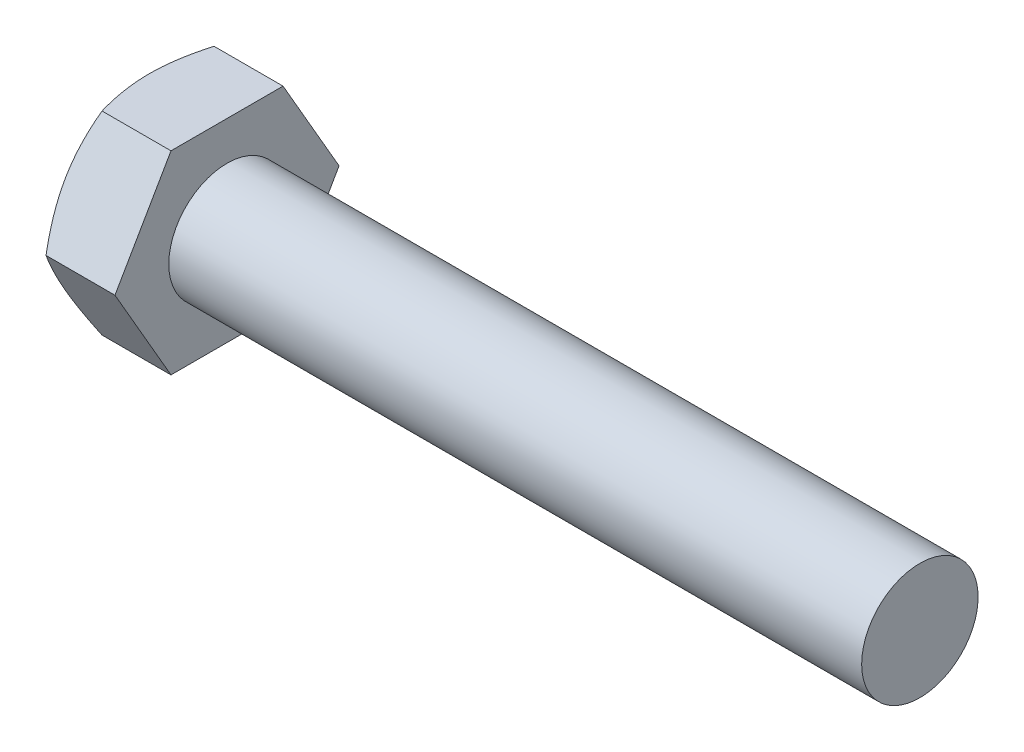
ISO-10303-21;
HEADER;
FILE_DESCRIPTION(('STEP AP214'),'2;1');
FILE_NAME('part.step','',(''),(''),'','','');
FILE_SCHEMA(('AUTOMOTIVE_DESIGN { 1 0 10303 214 1 1 1 1 }'));
ENDSEC;
DATA;
#1=APPLICATION_CONTEXT('core data for automotive mechanical design processes');
#2=APPLICATION_PROTOCOL_DEFINITION('international standard','automotive_design',2000,#1);
#3=PRODUCT_CONTEXT('',#1,'mechanical');
#4=PRODUCT('Part','Part','',(#3));
#5=PRODUCT_RELATED_PRODUCT_CATEGORY('part','',(#4));
#6=PRODUCT_DEFINITION_FORMATION('','',#4);
#7=PRODUCT_DEFINITION_CONTEXT('part definition',#1,'design');
#8=PRODUCT_DEFINITION('design','',#6,#7);
#9=PRODUCT_DEFINITION_SHAPE('','',#8);
#10=(LENGTH_UNIT() NAMED_UNIT(*) SI_UNIT(.MILLI.,.METRE.));
#11=(NAMED_UNIT(*) PLANE_ANGLE_UNIT() SI_UNIT($,.RADIAN.));
#12=(NAMED_UNIT(*) SI_UNIT($,.STERADIAN.) SOLID_ANGLE_UNIT());
#13=UNCERTAINTY_MEASURE_WITH_UNIT(LENGTH_MEASURE(1.E-05),#10,'distance_accuracy_value','');
#14=(GEOMETRIC_REPRESENTATION_CONTEXT(3) GLOBAL_UNCERTAINTY_ASSIGNED_CONTEXT((#13)) GLOBAL_UNIT_ASSIGNED_CONTEXT((#10,
#11,#12)) REPRESENTATION_CONTEXT('',''));
#15=CARTESIAN_POINT('',(0.,0.,0.));
#16=DIRECTION('',(0.,0.,1.));
#17=DIRECTION('',(1.,0.,0.));
#18=AXIS2_PLACEMENT_3D('',#15,#16,#17);
#19=CARTESIAN_POINT('',(35.7,0.,0.));
#20=DIRECTION('',(-1.,0.,0.));
#21=DIRECTION('',(0.,0.,1.));
#22=AXIS2_PLACEMENT_3D('',#19,#20,#21);
#23=CYLINDRICAL_SURFACE('',#22,3.);
#24=CARTESIAN_POINT('',(35.7,0.,0.));
#25=DIRECTION('',(1.,0.,0.));
#26=DIRECTION('',(0.,0.,-1.));
#27=AXIS2_PLACEMENT_3D('',#24,#25,#26);
#28=CIRCLE('',#27,3.);
#29=CARTESIAN_POINT('',(35.7,0.,3.));
#30=VERTEX_POINT('',#29);
#31=EDGE_CURVE('E148',#30,#30,#28,.T.);
#32=CARTESIAN_POINT('',(0.,0.,0.));
#33=DIRECTION('',(1.,0.,0.));
#34=DIRECTION('',(0.,0.,-1.));
#35=AXIS2_PLACEMENT_3D('',#32,#33,#34);
#36=CIRCLE('',#35,3.);
#37=CARTESIAN_POINT('',(0.,0.,3.));
#38=VERTEX_POINT('',#37);
#39=EDGE_CURVE('E147',#38,#38,#36,.T.);
#40=CARTESIAN_POINT('',(35.7,0.,3.));
#41=CARTESIAN_POINT('',(35.328125,0.,3.));
#42=CARTESIAN_POINT('',(34.95625,0.,3.));
#43=CARTESIAN_POINT('',(34.2125,0.,3.));
#44=CARTESIAN_POINT('',(33.840625,0.,3.));
#45=CARTESIAN_POINT('',(33.096875,0.,3.));
#46=CARTESIAN_POINT('',(32.725,0.,3.));
#47=CARTESIAN_POINT('',(31.98125,0.,3.));
#48=CARTESIAN_POINT('',(31.609375,0.,3.));
#49=CARTESIAN_POINT('',(30.865625,0.,3.));
#50=CARTESIAN_POINT('',(30.49375,0.,3.));
#51=CARTESIAN_POINT('',(29.75,0.,3.));
#52=CARTESIAN_POINT('',(29.378125,0.,3.));
#53=CARTESIAN_POINT('',(28.634375,0.,3.));
#54=CARTESIAN_POINT('',(28.2625,0.,3.));
#55=CARTESIAN_POINT('',(27.51875,0.,3.));
#56=CARTESIAN_POINT('',(27.146875,0.,3.));
#57=CARTESIAN_POINT('',(26.403125,0.,3.));
#58=CARTESIAN_POINT('',(26.03125,0.,3.));
#59=CARTESIAN_POINT('',(25.2875,0.,3.));
#60=CARTESIAN_POINT('',(24.915625,0.,3.));
#61=CARTESIAN_POINT('',(24.171875,0.,3.));
#62=CARTESIAN_POINT('',(23.8,0.,3.));
#63=CARTESIAN_POINT('',(23.05625,0.,3.));
#64=CARTESIAN_POINT('',(22.684375,0.,3.));
#65=CARTESIAN_POINT('',(21.940625,0.,3.));
#66=CARTESIAN_POINT('',(21.56875,0.,3.));
#67=CARTESIAN_POINT('',(20.825,0.,3.));
#68=CARTESIAN_POINT('',(20.453125,0.,3.));
#69=CARTESIAN_POINT('',(19.709375,0.,3.));
#70=CARTESIAN_POINT('',(19.3375,0.,3.));
#71=CARTESIAN_POINT('',(18.59375,0.,3.));
#72=CARTESIAN_POINT('',(18.221875,0.,3.));
#73=CARTESIAN_POINT('',(17.478125,0.,3.));
#74=CARTESIAN_POINT('',(17.10625,0.,3.));
#75=CARTESIAN_POINT('',(16.3625,0.,3.));
#76=CARTESIAN_POINT('',(15.990625,0.,3.));
#77=CARTESIAN_POINT('',(15.246875,0.,3.));
#78=CARTESIAN_POINT('',(14.875,0.,3.));
#79=CARTESIAN_POINT('',(14.13125,0.,3.));
#80=CARTESIAN_POINT('',(13.759375,0.,3.));
#81=CARTESIAN_POINT('',(13.015625,0.,3.));
#82=CARTESIAN_POINT('',(12.64375,0.,3.));
#83=CARTESIAN_POINT('',(11.9,0.,3.));
#84=CARTESIAN_POINT('',(11.528125,0.,3.));
#85=CARTESIAN_POINT('',(10.784375,0.,3.));
#86=CARTESIAN_POINT('',(10.4125,0.,3.));
#87=CARTESIAN_POINT('',(9.66875,0.,3.));
#88=CARTESIAN_POINT('',(9.296875,0.,3.));
#89=CARTESIAN_POINT('',(8.55312499999999,0.,3.));
#90=CARTESIAN_POINT('',(8.18124999999999,0.,3.));
#91=CARTESIAN_POINT('',(7.43749999999999,0.,3.));
#92=CARTESIAN_POINT('',(7.06562499999999,0.,3.));
#93=CARTESIAN_POINT('',(6.321875,0.,3.));
#94=CARTESIAN_POINT('',(5.95,0.,3.));
#95=CARTESIAN_POINT('',(5.20625,0.,3.));
#96=CARTESIAN_POINT('',(4.834375,0.,3.));
#97=CARTESIAN_POINT('',(4.090625,0.,3.));
#98=CARTESIAN_POINT('',(3.71875,0.,3.));
#99=CARTESIAN_POINT('',(2.975,0.,3.));
#100=CARTESIAN_POINT('',(2.603125,0.,3.));
#101=CARTESIAN_POINT('',(1.859375,0.,3.));
#102=CARTESIAN_POINT('',(1.4875,0.,3.));
#103=CARTESIAN_POINT('',(0.743750000000002,0.,3.));
#104=CARTESIAN_POINT('',(0.371875000000001,0.,3.));
#105=CARTESIAN_POINT('',(0.,0.,3.));
#106=B_SPLINE_CURVE_WITH_KNOTS('',3,(#40,#41,#42,#43,#44,#45,#46,#47,#48,#49,#50,#51,#52,#53,
#54,#55,#56,#57,#58,#59,#60,#61,#62,#63,#64,#65,#66,#67,#68,#69,#70,#71,#72,#73,#74,#75,#76,#77,
#78,#79,#80,#81,#82,#83,#84,#85,#86,#87,#88,#89,#90,#91,#92,#93,#94,#95,#96,#97,#98,#99,#100,
#101,#102,#103,#104,#105),.UNSPECIFIED.,.F.,.F.,(4,2,2,2,2,2,2,2,2,2,2,2,2,2,2,2,2,2,2,2,2,2,2,
2,2,2,2,2,2,2,2,2,4),(0.,1.115625,2.23125,3.34687500000001,4.4625,5.578125,6.69375,7.809375,
8.925,10.040625,11.15625,12.271875,13.3875,14.503125,15.61875,16.734375,17.85,18.965625,
20.08125,21.196875,22.3125,23.428125,24.54375,25.659375,26.775,27.890625,29.00625,30.121875,
31.2375,32.353125,33.46875,34.584375,35.7),.UNSPECIFIED.);
#107=EDGE_CURVE('BSEAM41',#30,#38,#106,.T.);
#108=ORIENTED_EDGE('',*,*,#31,.F.);
#109=ORIENTED_EDGE('',*,*,#39,.T.);
#110=ORIENTED_EDGE('',*,*,#107,.T.);
#111=ORIENTED_EDGE('',*,*,#107,.F.);
#112=EDGE_LOOP('',(#108,#110,#109,#111));
#113=FACE_BOUND('',#112,.T.);
#114=ADVANCED_FACE('F41',(#113),#23,.T.);
#115=CARTESIAN_POINT('',(35.7,0.,0.));
#116=DIRECTION('',(1.,0.,0.));
#117=DIRECTION('',(0.,0.,-1.));
#118=AXIS2_PLACEMENT_3D('',#115,#116,#117);
#119=PLANE('',#118);
#120=ORIENTED_EDGE('',*,*,#31,.T.);
#121=EDGE_LOOP('',(#120));
#122=FACE_BOUND('',#121,.T.);
#123=ADVANCED_FACE('F267',(#122),#119,.T.);
#124=CARTESIAN_POINT('',(-4.,-5.,2.88675134594813));
#125=DIRECTION('',(0.,0.5,-0.866025403784439));
#126=DIRECTION('',(0.,0.866025403784439,0.5));
#127=AXIS2_PLACEMENT_3D('',#124,#125,#126);
#128=PLANE('',#127);
#129=DIRECTION('',(1.,0.,0.));
#130=VECTOR('',#129,1.);
#131=CARTESIAN_POINT('',(-4.,0.,5.77350269189626));
#132=LINE('',#131,#130);
#133=CARTESIAN_POINT('',(-3.5534180126148,0.,5.77350269189626));
#134=VERTEX_POINT('',#133);
#135=CARTESIAN_POINT('',(0.,0.,5.77350269189626));
#136=VERTEX_POINT('',#135);
#137=EDGE_CURVE('E145',#134,#136,#132,.T.);
#138=ORIENTED_EDGE('',*,*,#137,.F.);
#139=CARTESIAN_POINT('',(-3.55335134394817,0.00020000000000018,5.7736181619501));
#140=CARTESIAN_POINT('',(-3.62661343236237,-0.219534594525185,5.64675433465071));
#141=CARTESIAN_POINT('',(-3.69324867808191,-0.44114858445958,5.5188054379059));
#142=CARTESIAN_POINT('',(-3.80956100898919,-0.888213995453513,5.26069210252318));
#143=CARTESIAN_POINT('',(-3.85919695008421,-1.11367335959077,5.13052307794721));
#144=CARTESIAN_POINT('',(-3.9364489745813,-1.56183230522351,4.87177839004641));
#145=CARTESIAN_POINT('',(-3.96457962171651,-1.78446209310419,4.74324302208387));
#146=CARTESIAN_POINT('',(-3.98980507804631,-2.11918990184664,4.54998783160116));
#147=CARTESIAN_POINT('',(-3.99538654023051,-2.23084219680506,4.48552534905128));
#148=CARTESIAN_POINT('',(-4.00079778324853,-2.4542499706738,4.35654081066911));
#149=CARTESIAN_POINT('',(-4.00062774174179,-2.56600544629031,4.2920187567385));
#150=CARTESIAN_POINT('',(-3.99224636820796,-2.87218423085064,4.11524635305244));
#151=CARTESIAN_POINT('',(-3.97817022810274,-3.06650608596721,4.00305457769146));
#152=CARTESIAN_POINT('',(-3.93353474289057,-3.4538601019977,3.77941563226458));
#153=CARTESIAN_POINT('',(-3.90296013985249,-3.64689090137157,3.66796924828419));
#154=CARTESIAN_POINT('',(-3.82653150637883,-4.03502534247485,3.44387972423144));
#155=CARTESIAN_POINT('',(-3.78035362112132,-4.23007999864174,3.3312648659868));
#156=CARTESIAN_POINT('',(-3.67554820550807,-4.61728034535877,3.10771464157941));
#157=CARTESIAN_POINT('',(-3.61694529656263,-4.80943099540809,2.99677641204847));
#158=CARTESIAN_POINT('',(-3.55335134394817,-5.0002,2.88663587589429));
#159=B_SPLINE_CURVE_WITH_KNOTS('',3,(#139,#140,#141,#142,#143,#144,#145,#146,#147,#148,#149,
#150,#151,#152,#153,#154,#155,#156,#157,#158),.UNSPECIFIED.,.F.,.F.,(4,2,2,2,2,2,2,2,2,4),(0.,
0.792555841363089,1.58701660053333,2.3618153748728,2.74884076077325,3.13585419177295,
3.80962362599679,4.48401723901189,5.17336882348929,5.86136694793725),.UNSPECIFIED.);
#160=CARTESIAN_POINT('',(-4.,-2.5,4.33012701892219));
#161=VERTEX_POINT('',#160);
#162=EDGE_CURVE('E129',#134,#161,#159,.T.);
#163=ORIENTED_EDGE('',*,*,#162,.T.);
#164=CARTESIAN_POINT('',(-3.5534180126148,-5.,2.88675134594812));
#165=VERTEX_POINT('',#164);
#166=EDGE_CURVE('E196',#161,#165,#159,.T.);
#167=ORIENTED_EDGE('',*,*,#166,.T.);
#168=DIRECTION('',(1.,0.,0.));
#169=VECTOR('',#168,1.);
#170=CARTESIAN_POINT('',(-4.,-5.,2.88675134594813));
#171=LINE('',#170,#169);
#172=CARTESIAN_POINT('',(0.,-5.,2.88675134594813));
#173=VERTEX_POINT('',#172);
#174=EDGE_CURVE('E140',#165,#173,#171,.T.);
#175=ORIENTED_EDGE('',*,*,#174,.T.);
#176=DIRECTION('',(0.,0.866025403784439,0.5));
#177=VECTOR('',#176,1.);
#178=CARTESIAN_POINT('',(0.,-5.,2.88675134594813));
#179=LINE('',#178,#177);
#180=EDGE_CURVE('E164',#173,#136,#179,.T.);
#181=ORIENTED_EDGE('',*,*,#180,.T.);
#182=EDGE_LOOP('',(#138,#163,#167,#175,#181));
#183=FACE_BOUND('',#182,.T.);
#184=ADVANCED_FACE('F194',(#183),#128,.F.);
#185=CARTESIAN_POINT('',(-4.,0.,5.77350269189626));
#186=DIRECTION('',(0.,-0.5,-0.866025403784439));
#187=DIRECTION('',(0.,0.866025403784439,-0.5));
#188=AXIS2_PLACEMENT_3D('',#185,#186,#187);
#189=PLANE('',#188);
#190=DIRECTION('',(1.,0.,0.));
#191=VECTOR('',#190,1.);
#192=CARTESIAN_POINT('',(-4.,5.,2.88675134594813));
#193=LINE('',#192,#191);
#194=CARTESIAN_POINT('',(-3.5534180126148,5.,2.88675134594812));
#195=VERTEX_POINT('',#194);
#196=CARTESIAN_POINT('',(0.,5.,2.88675134594813));
#197=VERTEX_POINT('',#196);
#198=EDGE_CURVE('E138',#195,#197,#193,.T.);
#199=ORIENTED_EDGE('',*,*,#198,.F.);
#200=CARTESIAN_POINT('',(-3.55335134394817,5.0002,2.88663587589429));
#201=CARTESIAN_POINT('',(-3.62661343236237,4.78046540547482,3.01349970319368));
#202=CARTESIAN_POINT('',(-3.69324867808191,4.55885141554042,3.14144859993849));
#203=CARTESIAN_POINT('',(-3.80956100898919,4.11178600454649,3.39956193532121));
#204=CARTESIAN_POINT('',(-3.85919695008421,3.88632664040923,3.52973095989718));
#205=CARTESIAN_POINT('',(-3.9364489745813,3.43816769477649,3.78847564779798));
#206=CARTESIAN_POINT('',(-3.96457962171651,3.21553790689581,3.91701101576052));
#207=CARTESIAN_POINT('',(-3.98980507804631,2.88081009815336,4.11026620624322));
#208=CARTESIAN_POINT('',(-3.99538654023051,2.76915780319494,4.17472868879311));
#209=CARTESIAN_POINT('',(-4.00079778324853,2.54575002932621,4.30371322717528));
#210=CARTESIAN_POINT('',(-4.00062774174179,2.43399455370969,4.36823528110589));
#211=CARTESIAN_POINT('',(-3.99224636820796,2.12781576914936,4.54500768479194));
#212=CARTESIAN_POINT('',(-3.97817022810275,1.93349391403279,4.65719946015292));
#213=CARTESIAN_POINT('',(-3.93353474289057,1.5461398980023,4.88083840557981));
#214=CARTESIAN_POINT('',(-3.90296013985249,1.35310909862843,4.9922847895602));
#215=CARTESIAN_POINT('',(-3.82653150637883,0.964974657525146,5.21637431361295));
#216=CARTESIAN_POINT('',(-3.78035362112132,0.769920001358265,5.32898917185759));
#217=CARTESIAN_POINT('',(-3.67554820550807,0.382719654641232,5.55253939626498));
#218=CARTESIAN_POINT('',(-3.61694529656263,0.190569004591914,5.66347762579592));
#219=CARTESIAN_POINT('',(-3.55335134394817,-0.000199999999999711,5.7736181619501));
#220=B_SPLINE_CURVE_WITH_KNOTS('',3,(#200,#201,#202,#203,#204,#205,#206,#207,#208,#209,#210,
#211,#212,#213,#214,#215,#216,#217,#218,#219),.UNSPECIFIED.,.F.,.F.,(4,2,2,2,2,2,2,2,2,4),(0.,
0.79255584136309,1.58701660053333,2.3618153748728,2.74884076077325,3.13585419177294,
3.80962362599679,4.48401723901189,5.17336882348928,5.86136694793725),.UNSPECIFIED.);
#221=CARTESIAN_POINT('',(-4.,2.5,4.33012701892219));
#222=VERTEX_POINT('',#221);
#223=EDGE_CURVE('E253',#195,#222,#220,.T.);
#224=ORIENTED_EDGE('',*,*,#223,.T.);
#225=EDGE_CURVE('E118',#222,#134,#220,.T.);
#226=ORIENTED_EDGE('',*,*,#225,.T.);
#227=ORIENTED_EDGE('',*,*,#137,.T.);
#228=DIRECTION('',(0.,0.866025403784439,-0.5));
#229=VECTOR('',#228,1.);
#230=CARTESIAN_POINT('',(0.,0.,5.77350269189626));
#231=LINE('',#230,#229);
#232=EDGE_CURVE('E169',#136,#197,#231,.T.);
#233=ORIENTED_EDGE('',*,*,#232,.T.);
#234=EDGE_LOOP('',(#199,#224,#226,#227,#233));
#235=FACE_BOUND('',#234,.T.);
#236=ADVANCED_FACE('F206',(#235),#189,.F.);
#237=CARTESIAN_POINT('',(-4.,5.,2.88675134594813));
#238=DIRECTION('',(0.,-1.,0.));
#239=DIRECTION('',(0.,0.,-1.));
#240=AXIS2_PLACEMENT_3D('',#237,#238,#239);
#241=PLANE('',#240);
#242=DIRECTION('',(1.,0.,0.));
#243=VECTOR('',#242,1.);
#244=CARTESIAN_POINT('',(-4.,5.,-2.88675134594813));
#245=LINE('',#244,#243);
#246=CARTESIAN_POINT('',(-3.5534180126148,5.,-2.88675134594813));
#247=VERTEX_POINT('',#246);
#248=CARTESIAN_POINT('',(0.,5.,-2.88675134594813));
#249=VERTEX_POINT('',#248);
#250=EDGE_CURVE('E135',#247,#249,#245,.T.);
#251=ORIENTED_EDGE('',*,*,#250,.F.);
#252=CARTESIAN_POINT('',(-1.10452353026786,5.,-8.67769989901018));
#253=CARTESIAN_POINT('',(-1.208411678307,5.,-8.46999549957049));
#254=CARTESIAN_POINT('',(-1.31158263221653,5.,-8.26192857152029));
#255=CARTESIAN_POINT('',(-1.51614356461213,5.,-7.84490442766506));
#256=CARTESIAN_POINT('',(-1.61753342363025,5.,-7.63594715329878));
#257=CARTESIAN_POINT('',(-1.8183738670025,5.,-7.2165824620712));
#258=CARTESIAN_POINT('',(-1.91782012916566,5.,-7.00617297083903));
#259=CARTESIAN_POINT('',(-2.11408085398133,5.,-6.58413282248084));
#260=CARTESIAN_POINT('',(-2.21089536817885,5.,-6.37250218937048));
#261=CARTESIAN_POINT('',(-2.40556869365117,5.,-5.93822918094828));
#262=CARTESIAN_POINT('',(-2.50327849061294,5.,-5.71551978557233));
#263=CARTESIAN_POINT('',(-2.69424698877124,5.,-5.26820250921387));
#264=CARTESIAN_POINT('',(-2.78750584516143,5.,-5.04359469474662));
#265=CARTESIAN_POINT('',(-2.96832455795079,5.,-4.59223463012096));
#266=CARTESIAN_POINT('',(-3.05588769993605,5.,-4.36548370425787));
#267=CARTESIAN_POINT('',(-3.22378244712704,5.,-3.90933222338445));
#268=CARTESIAN_POINT('',(-3.30411484466864,5.,-3.67993196180087));
#269=CARTESIAN_POINT('',(-3.4732919444061,5.,-3.16390484606838));
#270=CARTESIAN_POINT('',(-3.5597158711951,5.,-2.87647211871409));
#271=CARTESIAN_POINT('',(-3.71355971006833,5.,-2.29642431473556));
#272=CARTESIAN_POINT('',(-3.78098132997756,5.,-2.0038097063448));
#273=CARTESIAN_POINT('',(-3.86312218276578,5.,-1.5639187607611));
#274=CARTESIAN_POINT('',(-3.8872097352011,5.,-1.41837577964727));
#275=CARTESIAN_POINT('',(-3.92878586653768,5.,-1.12635842901189));
#276=CARTESIAN_POINT('',(-3.94627539907545,5.,-0.979884197201749));
#277=CARTESIAN_POINT('',(-3.97413236405401,5.,-0.686297290424494));
#278=CARTESIAN_POINT('',(-3.98450184744371,5.,-0.539184811603662));
#279=CARTESIAN_POINT('',(-3.99779052304871,5.,-0.244620623595926));
#280=CARTESIAN_POINT('',(-4.00070974658334,5.,-0.0971689158376774));
#281=CARTESIAN_POINT('',(-3.99899344261343,5.,0.198573402575844));
#282=CARTESIAN_POINT('',(-3.99431256971376,5.,0.34686374918098));
#283=CARTESIAN_POINT('',(-3.9774702731888,5.,0.643014838668123));
#284=CARTESIAN_POINT('',(-3.96530881632949,5.,0.790875579638588));
#285=CARTESIAN_POINT('',(-3.93389230888483,5.,1.0858920423211));
#286=CARTESIAN_POINT('',(-3.91463457364897,5.,1.23304747583125));
#287=CARTESIAN_POINT('',(-3.86959263924468,5.,1.52634780050896));
#288=CARTESIAN_POINT('',(-3.84380821166372,5.,1.67249265612574));
#289=CARTESIAN_POINT('',(-3.75668256988162,5.,2.11408994754182));
#290=CARTESIAN_POINT('',(-3.68613563774428,5.,2.40773999823979));
#291=CARTESIAN_POINT('',(-3.52649261863847,5.,2.98996510032815));
#292=CARTESIAN_POINT('',(-3.43738610188605,5.,3.2785371987903));
#293=CARTESIAN_POINT('',(-3.26587062387846,5.,3.790241794612));
#294=CARTESIAN_POINT('',(-3.18605773283768,5.,4.01425747334157));
#295=CARTESIAN_POINT('',(-3.01978602799212,5.,4.45972536136056));
#296=CARTESIAN_POINT('',(-2.93332904329825,5.,4.6811782570017));
#297=CARTESIAN_POINT('',(-2.75511770374831,5.,5.12210633953825));
#298=CARTESIAN_POINT('',(-2.66335976385622,5.,5.34158006915495));
#299=CARTESIAN_POINT('',(-2.47568479264989,5.,5.77874375147833));
#300=CARTESIAN_POINT('',(-2.37976763007032,5.,5.99643364762894));
#301=CARTESIAN_POINT('',(-2.18872983291713,5.,6.4211505710805));
#302=CARTESIAN_POINT('',(-2.09374666202136,5.,6.62823962150207));
#303=CARTESIAN_POINT('',(-1.90129295898707,5.,7.04125269120469));
#304=CARTESIAN_POINT('',(-1.80382246544802,5.,7.24717672850447));
#305=CARTESIAN_POINT('',(-1.6070113926853,5.,7.65767872257997));
#306=CARTESIAN_POINT('',(-1.50767443156454,5.,7.86225841752673));
#307=CARTESIAN_POINT('',(-1.30729574837575,5.,8.27057470184742));
#308=CARTESIAN_POINT('',(-1.20625407390076,5.,8.47431131456183));
#309=CARTESIAN_POINT('',(-1.10452353026786,5.,8.67769989901018));
#310=B_SPLINE_CURVE_WITH_KNOTS('',3,(#252,#253,#254,#255,#256,#257,#258,#259,#260,#261,#262,
#263,#264,#265,#266,#267,#268,#269,#270,#271,#272,#273,#274,#275,#276,#277,#278,#279,#280,#281,
#282,#283,#284,#285,#286,#287,#288,#289,#290,#291,#292,#293,#294,#295,#296,#297,#298,#299,#300,
#301,#302,#303,#304,#305,#306,#307,#308,#309),.UNSPECIFIED.,.F.,.F.,(4,2,2,2,2,2,2,2,2,2,2,2,2,
2,2,2,2,2,2,2,2,2,2,2,2,2,2,2,4),(0.,0.69671365657365,1.39347386853974,2.09163890900885,
2.78979026545806,3.51935463562382,4.24889354901043,4.97800782414732,5.70704210634686,
6.6070202336335,7.50691744992128,7.94935972093777,8.39173801959499,8.83398883650023,
9.27623779427301,9.7211351062603,10.1660343948096,10.6111021699031,11.0561855230418,
11.9612951407398,12.8669147747757,13.58021856303,14.2933266782872,15.0069228464768,
15.720541552222,16.4040197454066,17.0874873384909,17.7697443652452,18.4519823758207),.UNSPECIFIED.);
#311=CARTESIAN_POINT('',(-4.,5.,0.));
#312=VERTEX_POINT('',#311);
#313=EDGE_CURVE('E172',#247,#312,#310,.T.);
#314=ORIENTED_EDGE('',*,*,#313,.T.);
#315=EDGE_CURVE('E177',#312,#195,#310,.T.);
#316=ORIENTED_EDGE('',*,*,#315,.T.);
#317=ORIENTED_EDGE('',*,*,#198,.T.);
#318=DIRECTION('',(0.,0.,-1.));
#319=VECTOR('',#318,1.);
#320=CARTESIAN_POINT('',(0.,5.,2.88675134594813));
#321=LINE('',#320,#319);
#322=EDGE_CURVE('E174',#197,#249,#321,.T.);
#323=ORIENTED_EDGE('',*,*,#322,.T.);
#324=EDGE_LOOP('',(#251,#314,#316,#317,#323));
#325=FACE_BOUND('',#324,.T.);
#326=ADVANCED_FACE('F201',(#325),#241,.F.);
#327=CARTESIAN_POINT('',(-4.,5.,-2.88675134594813));
#328=DIRECTION('',(0.,-0.5,0.866025403784439));
#329=DIRECTION('',(0.,-0.866025403784439,-0.5));
#330=AXIS2_PLACEMENT_3D('',#327,#328,#329);
#331=PLANE('',#330);
#332=DIRECTION('',(1.,0.,0.));
#333=VECTOR('',#332,1.);
#334=CARTESIAN_POINT('',(-4.,0.,-5.77350269189626));
#335=LINE('',#334,#333);
#336=CARTESIAN_POINT('',(-3.5534180126148,0.,-5.77350269189626));
#337=VERTEX_POINT('',#336);
#338=CARTESIAN_POINT('',(0.,0.,-5.77350269189626));
#339=VERTEX_POINT('',#338);
#340=EDGE_CURVE('E126',#337,#339,#335,.T.);
#341=ORIENTED_EDGE('',*,*,#340,.F.);
#342=CARTESIAN_POINT('',(-3.55335134394817,-0.000199999999999485,-5.77361816195009));
#343=CARTESIAN_POINT('',(-3.62661343236237,0.219534594525185,-5.6467543346507));
#344=CARTESIAN_POINT('',(-3.69324867808191,0.441148584459581,-5.51880543790589));
#345=CARTESIAN_POINT('',(-3.80956100898919,0.888213995453513,-5.26069210252318));
#346=CARTESIAN_POINT('',(-3.85919695008421,1.11367335959077,-5.13052307794721));
#347=CARTESIAN_POINT('',(-3.9364489745813,1.56183230522351,-4.87177839004641));
#348=CARTESIAN_POINT('',(-3.96457962171651,1.78446209310419,-4.74324302208387));
#349=CARTESIAN_POINT('',(-3.98980507804631,2.11918990184664,-4.54998783160116));
#350=CARTESIAN_POINT('',(-3.99538654023051,2.23084219680506,-4.48552534905128));
#351=CARTESIAN_POINT('',(-4.00079778324853,2.45424997067379,-4.35654081066911));
#352=CARTESIAN_POINT('',(-4.00062774174179,2.56600544629031,-4.2920187567385));
#353=CARTESIAN_POINT('',(-3.99224636820796,2.87218423085064,-4.11524635305244));
#354=CARTESIAN_POINT('',(-3.97817022810275,3.06650608596721,-4.00305457769146));
#355=CARTESIAN_POINT('',(-3.93353474289057,3.4538601019977,-3.77941563226457));
#356=CARTESIAN_POINT('',(-3.90296013985249,3.64689090137157,-3.66796924828418));
#357=CARTESIAN_POINT('',(-3.82653150637884,4.03502534247485,-3.44387972423144));
#358=CARTESIAN_POINT('',(-3.78035362112132,4.23007999864173,-3.3312648659868));
#359=CARTESIAN_POINT('',(-3.67554820550807,4.61728034535877,-3.1077146415794));
#360=CARTESIAN_POINT('',(-3.61694529656263,4.80943099540809,-2.99677641204847));
#361=CARTESIAN_POINT('',(-3.55335134394817,5.0002,-2.88663587589429));
#362=B_SPLINE_CURVE_WITH_KNOTS('',3,(#342,#343,#344,#345,#346,#347,#348,#349,#350,#351,#352,
#353,#354,#355,#356,#357,#358,#359,#360,#361),.UNSPECIFIED.,.F.,.F.,(4,2,2,2,2,2,2,2,2,4),(0.,
0.792555841363089,1.58701660053333,2.3618153748728,2.74884076077325,3.13585419177294,
3.80962362599679,4.48401723901189,5.17336882348928,5.86136694793725),.UNSPECIFIED.);
#363=CARTESIAN_POINT('',(-4.,2.5,-4.33012701892219));
#364=VERTEX_POINT('',#363);
#365=EDGE_CURVE('E110',#337,#364,#362,.T.);
#366=ORIENTED_EDGE('',*,*,#365,.T.);
#367=EDGE_CURVE('E120',#364,#247,#362,.T.);
#368=ORIENTED_EDGE('',*,*,#367,.T.);
#369=ORIENTED_EDGE('',*,*,#250,.T.);
#370=DIRECTION('',(0.,-0.866025403784439,-0.5));
#371=VECTOR('',#370,1.);
#372=CARTESIAN_POINT('',(0.,5.,-2.88675134594813));
#373=LINE('',#372,#371);
#374=EDGE_CURVE('E133',#249,#339,#373,.T.);
#375=ORIENTED_EDGE('',*,*,#374,.T.);
#376=EDGE_LOOP('',(#341,#366,#368,#369,#375));
#377=FACE_BOUND('',#376,.T.);
#378=ADVANCED_FACE('F131',(#377),#331,.F.);
#379=CARTESIAN_POINT('',(-4.,0.,-5.77350269189626));
#380=DIRECTION('',(0.,0.5,0.866025403784439));
#381=DIRECTION('',(0.,-0.866025403784439,0.5));
#382=AXIS2_PLACEMENT_3D('',#379,#380,#381);
#383=PLANE('',#382);
#384=DIRECTION('',(1.,0.,0.));
#385=VECTOR('',#384,1.);
#386=CARTESIAN_POINT('',(-4.,-5.,-2.88675134594813));
#387=LINE('',#386,#385);
#388=CARTESIAN_POINT('',(-3.5534180126148,-5.,-2.88675134594813));
#389=VERTEX_POINT('',#388);
#390=CARTESIAN_POINT('',(0.,-5.,-2.88675134594813));
#391=VERTEX_POINT('',#390);
#392=EDGE_CURVE('E136',#389,#391,#387,.T.);
#393=ORIENTED_EDGE('',*,*,#392,.F.);
#394=CARTESIAN_POINT('',(-3.55335134394817,-5.0002,-2.88663587589429));
#395=CARTESIAN_POINT('',(-3.62661343236237,-4.78046540547482,-3.01349970319368));
#396=CARTESIAN_POINT('',(-3.69324867808191,-4.55885141554042,-3.14144859993849));
#397=CARTESIAN_POINT('',(-3.80956100898919,-4.11178600454649,-3.39956193532121));
#398=CARTESIAN_POINT('',(-3.85919695008421,-3.88632664040923,-3.52973095989717));
#399=CARTESIAN_POINT('',(-3.9364489745813,-3.43816769477649,-3.78847564779797));
#400=CARTESIAN_POINT('',(-3.96457962171651,-3.21553790689581,-3.91701101576052));
#401=CARTESIAN_POINT('',(-3.98980507804631,-2.88081009815336,-4.11026620624322));
#402=CARTESIAN_POINT('',(-3.99538654023051,-2.76915780319494,-4.1747286887931));
#403=CARTESIAN_POINT('',(-4.00079778324853,-2.54575002932621,-4.30371322717527));
#404=CARTESIAN_POINT('',(-4.00062774174179,-2.43399455370969,-4.36823528110588));
#405=CARTESIAN_POINT('',(-3.99224636820796,-2.12781576914936,-4.54500768479194));
#406=CARTESIAN_POINT('',(-3.97817022810275,-1.93349391403279,-4.65719946015292));
#407=CARTESIAN_POINT('',(-3.93353474289057,-1.5461398980023,-4.88083840557981));
#408=CARTESIAN_POINT('',(-3.90296013985249,-1.35310909862843,-4.9922847895602));
#409=CARTESIAN_POINT('',(-3.82653150637884,-0.964974657525146,-5.21637431361294));
#410=CARTESIAN_POINT('',(-3.78035362112132,-0.769920001358265,-5.32898917185758));
#411=CARTESIAN_POINT('',(-3.67554820550807,-0.382719654641232,-5.55253939626498));
#412=CARTESIAN_POINT('',(-3.61694529656263,-0.190569004591913,-5.66347762579592));
#413=CARTESIAN_POINT('',(-3.55335134394817,0.000200000000000467,-5.77361816195009));
#414=B_SPLINE_CURVE_WITH_KNOTS('',3,(#394,#395,#396,#397,#398,#399,#400,#401,#402,#403,#404,
#405,#406,#407,#408,#409,#410,#411,#412,#413),.UNSPECIFIED.,.F.,.F.,(4,2,2,2,2,2,2,2,2,4),(0.,
0.79255584136309,1.58701660053333,2.3618153748728,2.74884076077325,3.13585419177294,
3.80962362599679,4.48401723901189,5.17336882348928,5.86136694793725),.UNSPECIFIED.);
#415=CARTESIAN_POINT('',(-4.,-2.5,-4.33012701892219));
#416=VERTEX_POINT('',#415);
#417=EDGE_CURVE('E128',#389,#416,#414,.T.);
#418=ORIENTED_EDGE('',*,*,#417,.T.);
#419=EDGE_CURVE('E63',#416,#337,#414,.T.);
#420=ORIENTED_EDGE('',*,*,#419,.T.);
#421=ORIENTED_EDGE('',*,*,#340,.T.);
#422=DIRECTION('',(0.,-0.866025403784439,0.5));
#423=VECTOR('',#422,1.);
#424=CARTESIAN_POINT('',(0.,0.,-5.77350269189626));
#425=LINE('',#424,#423);
#426=EDGE_CURVE('E190',#339,#391,#425,.T.);
#427=ORIENTED_EDGE('',*,*,#426,.T.);
#428=EDGE_LOOP('',(#393,#418,#420,#421,#427));
#429=FACE_BOUND('',#428,.T.);
#430=ADVANCED_FACE('F124',(#429),#383,.F.);
#431=CARTESIAN_POINT('',(-4.,-5.,-2.88675134594813));
#432=DIRECTION('',(0.,1.,0.));
#433=DIRECTION('',(0.,0.,1.));
#434=AXIS2_PLACEMENT_3D('',#431,#432,#433);
#435=PLANE('',#434);
#436=ORIENTED_EDGE('',*,*,#174,.F.);
#437=CARTESIAN_POINT('',(-1.10452353026786,-5.,8.67769989901018));
#438=CARTESIAN_POINT('',(-1.208411678307,-5.,8.46999549957049));
#439=CARTESIAN_POINT('',(-1.31158263221652,-5.,8.26192857152029));
#440=CARTESIAN_POINT('',(-1.51614356461213,-5.,7.84490442766506));
#441=CARTESIAN_POINT('',(-1.61753342363025,-5.,7.63594715329879));
#442=CARTESIAN_POINT('',(-1.8183738670025,-5.,7.2165824620712));
#443=CARTESIAN_POINT('',(-1.91782012916566,-5.,7.00617297083903));
#444=CARTESIAN_POINT('',(-2.11408085398133,-5.,6.58413282248085));
#445=CARTESIAN_POINT('',(-2.21089536817885,-5.,6.37250218937049));
#446=CARTESIAN_POINT('',(-2.40556869365117,-5.,5.93822918094828));
#447=CARTESIAN_POINT('',(-2.50327849061294,-5.,5.71551978557233));
#448=CARTESIAN_POINT('',(-2.69424698877124,-5.,5.26820250921388));
#449=CARTESIAN_POINT('',(-2.78750584516143,-5.,5.04359469474662));
#450=CARTESIAN_POINT('',(-2.96832455795079,-5.,4.59223463012096));
#451=CARTESIAN_POINT('',(-3.05588769993605,-5.,4.36548370425788));
#452=CARTESIAN_POINT('',(-3.22378244712704,-5.,3.90933222338445));
#453=CARTESIAN_POINT('',(-3.30411484466864,-5.,3.67993196180087));
#454=CARTESIAN_POINT('',(-3.4732919444061,-5.,3.16390484606839));
#455=CARTESIAN_POINT('',(-3.5597158711951,-5.,2.8764721187141));
#456=CARTESIAN_POINT('',(-3.71355971006833,-5.,2.29642431473557));
#457=CARTESIAN_POINT('',(-3.78098132997756,-5.,2.0038097063448));
#458=CARTESIAN_POINT('',(-3.86312218276578,-5.,1.5639187607611));
#459=CARTESIAN_POINT('',(-3.8872097352011,-5.,1.41837577964727));
#460=CARTESIAN_POINT('',(-3.92878586653768,-5.,1.12635842901189));
#461=CARTESIAN_POINT('',(-3.94627539907545,-5.,0.979884197201751));
#462=CARTESIAN_POINT('',(-3.97413236405401,-5.,0.686297290424497));
#463=CARTESIAN_POINT('',(-3.98450184744371,-5.,0.539184811603665));
#464=CARTESIAN_POINT('',(-3.99779052304871,-5.,0.244620623595929));
#465=CARTESIAN_POINT('',(-4.00070974658334,-5.,0.0971689158376794));
#466=CARTESIAN_POINT('',(-3.99899344261343,-5.,-0.198573402575841));
#467=CARTESIAN_POINT('',(-3.99431256971376,-5.,-0.346863749180977));
#468=CARTESIAN_POINT('',(-3.9774702731888,-5.,-0.64301483866812));
#469=CARTESIAN_POINT('',(-3.96530881632949,-5.,-0.790875579638584));
#470=CARTESIAN_POINT('',(-3.93389230888483,-5.,-1.08589204232109));
#471=CARTESIAN_POINT('',(-3.91463457364897,-5.,-1.23304747583124));
#472=CARTESIAN_POINT('',(-3.86959263924468,-5.,-1.52634780050896));
#473=CARTESIAN_POINT('',(-3.84380821166372,-5.,-1.67249265612574));
#474=CARTESIAN_POINT('',(-3.75668256988162,-5.,-2.11408994754182));
#475=CARTESIAN_POINT('',(-3.68613563774428,-5.,-2.40773999823979));
#476=CARTESIAN_POINT('',(-3.52649261863847,-5.,-2.98996510032815));
#477=CARTESIAN_POINT('',(-3.43738610188605,-5.,-3.2785371987903));
#478=CARTESIAN_POINT('',(-3.26587062387846,-5.,-3.79024179461199));
#479=CARTESIAN_POINT('',(-3.18605773283768,-5.,-4.01425747334156));
#480=CARTESIAN_POINT('',(-3.01978602799212,-5.,-4.45972536136055));
#481=CARTESIAN_POINT('',(-2.93332904329825,-5.,-4.6811782570017));
#482=CARTESIAN_POINT('',(-2.75511770374831,-5.,-5.12210633953825));
#483=CARTESIAN_POINT('',(-2.66335976385622,-5.,-5.34158006915495));
#484=CARTESIAN_POINT('',(-2.47568479264989,-5.,-5.77874375147833));
#485=CARTESIAN_POINT('',(-2.37976763007032,-5.,-5.99643364762894));
#486=CARTESIAN_POINT('',(-2.18872983291713,-5.,-6.4211505710805));
#487=CARTESIAN_POINT('',(-2.09374666202136,-5.,-6.62823962150207));
#488=CARTESIAN_POINT('',(-1.90129295898707,-5.,-7.04125269120469));
#489=CARTESIAN_POINT('',(-1.80382246544802,-5.,-7.24717672850447));
#490=CARTESIAN_POINT('',(-1.6070113926853,-5.,-7.65767872257996));
#491=CARTESIAN_POINT('',(-1.50767443156454,-5.,-7.86225841752673));
#492=CARTESIAN_POINT('',(-1.30729574837575,-5.,-8.27057470184742));
#493=CARTESIAN_POINT('',(-1.20625407390076,-5.,-8.47431131456183));
#494=CARTESIAN_POINT('',(-1.10452353026786,-5.,-8.67769989901018));
#495=B_SPLINE_CURVE_WITH_KNOTS('',3,(#437,#438,#439,#440,#441,#442,#443,#444,#445,#446,#447,
#448,#449,#450,#451,#452,#453,#454,#455,#456,#457,#458,#459,#460,#461,#462,#463,#464,#465,#466,
#467,#468,#469,#470,#471,#472,#473,#474,#475,#476,#477,#478,#479,#480,#481,#482,#483,#484,#485,
#486,#487,#488,#489,#490,#491,#492,#493,#494),.UNSPECIFIED.,.F.,.F.,(4,2,2,2,2,2,2,2,2,2,2,2,2,
2,2,2,2,2,2,2,2,2,2,2,2,2,2,2,4),(0.,0.696713656573651,1.39347386853974,2.09163890900886,
2.78979026545806,3.51935463562382,4.24889354901044,4.97800782414732,5.70704210634686,
6.60702023363351,7.50691744992128,7.94935972093777,8.391738019595,8.83398883650024,
9.27623779427302,9.7211351062603,10.1660343948096,10.6111021699031,11.0561855230418,
11.9612951407398,12.8669147747757,13.58021856303,14.2933266782872,15.0069228464768,
15.720541552222,16.4040197454066,17.0874873384909,17.7697443652452,18.4519823758207),.UNSPECIFIED.);
#496=CARTESIAN_POINT('',(-4.,-5.,0.));
#497=VERTEX_POINT('',#496);
#498=EDGE_CURVE('E391',#165,#497,#495,.T.);
#499=ORIENTED_EDGE('',*,*,#498,.T.);
#500=EDGE_CURVE('E56',#497,#389,#495,.T.);
#501=ORIENTED_EDGE('',*,*,#500,.T.);
#502=ORIENTED_EDGE('',*,*,#392,.T.);
#503=DIRECTION('',(0.,0.,1.));
#504=VECTOR('',#503,1.);
#505=CARTESIAN_POINT('',(0.,-5.,-2.88675134594813));
#506=LINE('',#505,#504);
#507=EDGE_CURVE('E166',#391,#173,#506,.T.);
#508=ORIENTED_EDGE('',*,*,#507,.T.);
#509=EDGE_LOOP('',(#436,#499,#501,#502,#508));
#510=FACE_BOUND('',#509,.T.);
#511=ADVANCED_FACE('F158',(#510),#435,.F.);
#512=CARTESIAN_POINT('',(0.,0.,0.));
#513=DIRECTION('',(-1.,0.,0.));
#514=DIRECTION('',(0.,0.,1.));
#515=AXIS2_PLACEMENT_3D('',#512,#513,#514);
#516=PLANE('',#515);
#517=ORIENTED_EDGE('',*,*,#39,.F.);
#518=EDGE_LOOP('',(#517));
#519=FACE_BOUND('',#518,.T.);
#520=ORIENTED_EDGE('',*,*,#180,.F.);
#521=ORIENTED_EDGE('',*,*,#507,.F.);
#522=ORIENTED_EDGE('',*,*,#426,.F.);
#523=ORIENTED_EDGE('',*,*,#374,.F.);
#524=ORIENTED_EDGE('',*,*,#322,.F.);
#525=ORIENTED_EDGE('',*,*,#232,.F.);
#526=EDGE_LOOP('',(#520,#521,#522,#523,#524,#525));
#527=FACE_BOUND('',#526,.T.);
#528=ADVANCED_FACE('F154',(#519,#527),#516,.F.);
#529=CARTESIAN_POINT('',(-4.,0.,0.));
#530=DIRECTION('',(1.,0.,0.));
#531=DIRECTION('',(0.,0.,-1.));
#532=AXIS2_PLACEMENT_3D('',#529,#530,#531);
#533=CONICAL_SURFACE('',#532,5.,1.0471975511966);
#534=CARTESIAN_POINT('',(-4.,0.,0.));
#535=DIRECTION('',(-1.,0.,0.));
#536=DIRECTION('',(0.,0.,1.));
#537=AXIS2_PLACEMENT_3D('',#534,#535,#536);
#538=CIRCLE('',#537,4.99999999999999);
#539=EDGE_CURVE('E44',#222,#161,#538,.F.);
#540=ORIENTED_EDGE('',*,*,#539,.T.);
#541=ORIENTED_EDGE('',*,*,#162,.F.);
#542=ORIENTED_EDGE('',*,*,#225,.F.);
#543=EDGE_LOOP('',(#540,#541,#542));
#544=FACE_BOUND('',#543,.T.);
#545=ADVANCED_FACE('F157',(#544),#533,.T.);
#546=EDGE_CURVE('E392',#312,#222,#538,.F.);
#547=ORIENTED_EDGE('',*,*,#546,.T.);
#548=ORIENTED_EDGE('',*,*,#223,.F.);
#549=ORIENTED_EDGE('',*,*,#315,.F.);
#550=EDGE_LOOP('',(#547,#548,#549));
#551=FACE_BOUND('',#550,.T.);
#552=ADVANCED_FACE('F234',(#551),#533,.T.);
#553=ORIENTED_EDGE('',*,*,#367,.F.);
#554=CARTESIAN_POINT('',(-4.,0.,0.));
#555=DIRECTION('',(1.,0.,0.));
#556=DIRECTION('',(0.,0.,-1.));
#557=AXIS2_PLACEMENT_3D('',#554,#555,#556);
#558=CIRCLE('',#557,5.);
#559=EDGE_CURVE('E394',#364,#312,#558,.T.);
#560=ORIENTED_EDGE('',*,*,#559,.T.);
#561=ORIENTED_EDGE('',*,*,#313,.F.);
#562=EDGE_LOOP('',(#553,#560,#561));
#563=FACE_BOUND('',#562,.T.);
#564=ADVANCED_FACE('F230',(#563),#533,.T.);
#565=ORIENTED_EDGE('',*,*,#419,.F.);
#566=EDGE_CURVE('E113',#416,#364,#538,.F.);
#567=ORIENTED_EDGE('',*,*,#566,.T.);
#568=ORIENTED_EDGE('',*,*,#365,.F.);
#569=EDGE_LOOP('',(#565,#567,#568));
#570=FACE_BOUND('',#569,.T.);
#571=ADVANCED_FACE('F111',(#570),#533,.T.);
#572=ORIENTED_EDGE('',*,*,#500,.F.);
#573=EDGE_CURVE('E49',#497,#416,#538,.F.);
#574=ORIENTED_EDGE('',*,*,#573,.T.);
#575=ORIENTED_EDGE('',*,*,#417,.F.);
#576=EDGE_LOOP('',(#572,#574,#575));
#577=FACE_BOUND('',#576,.T.);
#578=ADVANCED_FACE('F236',(#577),#533,.T.);
#579=EDGE_CURVE('E11',#161,#497,#538,.F.);
#580=ORIENTED_EDGE('',*,*,#579,.T.);
#581=ORIENTED_EDGE('',*,*,#498,.F.);
#582=ORIENTED_EDGE('',*,*,#166,.F.);
#583=EDGE_LOOP('',(#580,#581,#582));
#584=FACE_BOUND('',#583,.T.);
#585=ADVANCED_FACE('F332',(#584),#533,.T.);
#586=CARTESIAN_POINT('',(-4.,0.,0.));
#587=DIRECTION('',(-1.,0.,0.));
#588=DIRECTION('',(0.,0.,1.));
#589=AXIS2_PLACEMENT_3D('',#586,#587,#588);
#590=PLANE('',#589);
#591=ORIENTED_EDGE('',*,*,#579,.F.);
#592=ORIENTED_EDGE('',*,*,#539,.F.);
#593=ORIENTED_EDGE('',*,*,#546,.F.);
#594=ORIENTED_EDGE('',*,*,#559,.F.);
#595=ORIENTED_EDGE('',*,*,#566,.F.);
#596=ORIENTED_EDGE('',*,*,#573,.F.);
#597=EDGE_LOOP('',(#591,#592,#593,#594,#595,#596));
#598=FACE_BOUND('',#597,.T.);
#599=ADVANCED_FACE('F237',(#598),#590,.T.);
#600=CLOSED_SHELL('',(#114,#123,#184,#236,#326,#378,#430,#511,#528,#545,#552,#564,#571,#578,
#585,#599));
#601=MANIFOLD_SOLID_BREP('B2',#600);
#602=ADVANCED_BREP_SHAPE_REPRESENTATION('',(#18,#601),#14);
#603=SHAPE_DEFINITION_REPRESENTATION(#9,#602);
ENDSEC;
END-ISO-10303-21;
